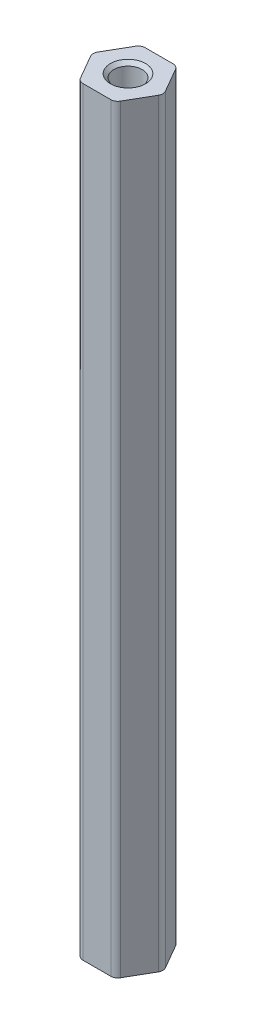
ISO-10303-21;
HEADER;
FILE_DESCRIPTION(('STEP AP214'),'2;1');
FILE_NAME('part.step','',(''),(''),'','','');
FILE_SCHEMA(('AUTOMOTIVE_DESIGN { 1 0 10303 214 1 1 1 1 }'));
ENDSEC;
DATA;
#1=APPLICATION_CONTEXT('core data for automotive mechanical design processes');
#2=APPLICATION_PROTOCOL_DEFINITION('international standard','automotive_design',2000,#1);
#3=PRODUCT_CONTEXT('',#1,'mechanical');
#4=PRODUCT('Part','Part','',(#3));
#5=PRODUCT_RELATED_PRODUCT_CATEGORY('part','',(#4));
#6=PRODUCT_DEFINITION_FORMATION('','',#4);
#7=PRODUCT_DEFINITION_CONTEXT('part definition',#1,'design');
#8=PRODUCT_DEFINITION('design','',#6,#7);
#9=PRODUCT_DEFINITION_SHAPE('','',#8);
#10=(LENGTH_UNIT() NAMED_UNIT(*) SI_UNIT(.MILLI.,.METRE.));
#11=(NAMED_UNIT(*) PLANE_ANGLE_UNIT() SI_UNIT($,.RADIAN.));
#12=(NAMED_UNIT(*) SI_UNIT($,.STERADIAN.) SOLID_ANGLE_UNIT());
#13=UNCERTAINTY_MEASURE_WITH_UNIT(LENGTH_MEASURE(1.E-05),#10,'distance_accuracy_value','');
#14=(GEOMETRIC_REPRESENTATION_CONTEXT(3) GLOBAL_UNCERTAINTY_ASSIGNED_CONTEXT((#13)) GLOBAL_UNIT_ASSIGNED_CONTEXT((#10,
#11,#12)) REPRESENTATION_CONTEXT('',''));
#15=CARTESIAN_POINT('',(0.,0.,0.));
#16=DIRECTION('',(0.,0.,1.));
#17=DIRECTION('',(1.,0.,0.));
#18=AXIS2_PLACEMENT_3D('',#15,#16,#17);
#19=CARTESIAN_POINT('',(-2.6035,55.0672,0.));
#20=DIRECTION('',(-0.866025403784438,0.,-0.500000000000001));
#21=DIRECTION('',(-0.500000000000001,0.,0.866025403784438));
#22=AXIS2_PLACEMENT_3D('',#19,#20,#21);
#23=PLANE('',#22);
#24=DIRECTION('',(0.500000000000001,0.,-0.866025403784438));
#25=VECTOR('',#24,1.);
#26=CARTESIAN_POINT('',(-2.6035,0.,0.));
#27=LINE('',#26,#25);
#28=CARTESIAN_POINT('',(-2.45685303162583,0.,-0.254000000000001));
#29=VERTEX_POINT('',#28);
#30=CARTESIAN_POINT('',(-1.44839696837416,0.,-2.00069713875279));
#31=VERTEX_POINT('',#30);
#32=EDGE_CURVE('E215',#29,#31,#27,.T.);
#33=ORIENTED_EDGE('',*,*,#32,.F.);
#34=DIRECTION('',(0.,-1.,0.));
#35=VECTOR('',#34,1.);
#36=CARTESIAN_POINT('',(-2.45685303162583,55.0672,-0.254000000000001));
#37=LINE('',#36,#35);
#38=CARTESIAN_POINT('',(-2.45685303162583,55.0672,-0.254000000000001));
#39=VERTEX_POINT('',#38);
#40=EDGE_CURVE('E170',#29,#39,#37,.F.);
#41=ORIENTED_EDGE('',*,*,#40,.T.);
#42=DIRECTION('',(0.500000000000001,0.,-0.866025403784438));
#43=VECTOR('',#42,1.);
#44=CARTESIAN_POINT('',(-2.6035,55.0672,0.));
#45=LINE('',#44,#43);
#46=CARTESIAN_POINT('',(-1.44839696837416,55.0672,-2.00069713875279));
#47=VERTEX_POINT('',#46);
#48=EDGE_CURVE('E147',#39,#47,#45,.T.);
#49=ORIENTED_EDGE('',*,*,#48,.T.);
#50=DIRECTION('',(0.,-1.,0.));
#51=VECTOR('',#50,1.);
#52=CARTESIAN_POINT('',(-1.44839696837416,55.0672,-2.00069713875279));
#53=LINE('',#52,#51);
#54=EDGE_CURVE('E167',#47,#31,#53,.T.);
#55=ORIENTED_EDGE('',*,*,#54,.T.);
#56=EDGE_LOOP('',(#33,#41,#49,#55));
#57=FACE_BOUND('',#56,.T.);
#58=ADVANCED_FACE('F36',(#57),#23,.T.);
#59=CARTESIAN_POINT('',(-1.30174999999999,55.0672,2.25469713875279));
#60=DIRECTION('',(-0.866025403784438,0.,0.500000000000001));
#61=DIRECTION('',(0.500000000000001,0.,0.866025403784438));
#62=AXIS2_PLACEMENT_3D('',#59,#60,#61);
#63=PLANE('',#62);
#64=DIRECTION('',(-0.500000000000001,0.,-0.866025403784438));
#65=VECTOR('',#64,1.);
#66=CARTESIAN_POINT('',(-1.30174999999999,55.0672,2.25469713875279));
#67=LINE('',#66,#65);
#68=CARTESIAN_POINT('',(-1.44839696837416,55.0672,2.00069713875279));
#69=VERTEX_POINT('',#68);
#70=CARTESIAN_POINT('',(-2.45685303162583,55.0672,0.254000000000001));
#71=VERTEX_POINT('',#70);
#72=EDGE_CURVE('E152',#69,#71,#67,.T.);
#73=ORIENTED_EDGE('',*,*,#72,.T.);
#74=DIRECTION('',(0.,-1.,0.));
#75=VECTOR('',#74,1.);
#76=CARTESIAN_POINT('',(-2.45685303162583,55.0672,0.254000000000001));
#77=LINE('',#76,#75);
#78=CARTESIAN_POINT('',(-2.45685303162583,0.,0.254000000000001));
#79=VERTEX_POINT('',#78);
#80=EDGE_CURVE('E146',#71,#79,#77,.T.);
#81=ORIENTED_EDGE('',*,*,#80,.T.);
#82=DIRECTION('',(-0.500000000000001,0.,-0.866025403784438));
#83=VECTOR('',#82,1.);
#84=CARTESIAN_POINT('',(-1.30174999999999,0.,2.25469713875279));
#85=LINE('',#84,#83);
#86=CARTESIAN_POINT('',(-1.44839696837416,0.,2.00069713875279));
#87=VERTEX_POINT('',#86);
#88=EDGE_CURVE('E129',#87,#79,#85,.T.);
#89=ORIENTED_EDGE('',*,*,#88,.F.);
#90=DIRECTION('',(0.,-1.,0.));
#91=VECTOR('',#90,1.);
#92=CARTESIAN_POINT('',(-1.44839696837416,55.0672,2.00069713875279));
#93=LINE('',#92,#91);
#94=EDGE_CURVE('E143',#87,#69,#93,.F.);
#95=ORIENTED_EDGE('',*,*,#94,.T.);
#96=EDGE_LOOP('',(#73,#81,#89,#95));
#97=FACE_BOUND('',#96,.T.);
#98=ADVANCED_FACE('F142',(#97),#63,.T.);
#99=CARTESIAN_POINT('',(1.30175,55.0672,2.25469713875279));
#100=DIRECTION('',(0.,0.,1.));
#101=DIRECTION('',(1.,0.,0.));
#102=AXIS2_PLACEMENT_3D('',#99,#100,#101);
#103=PLANE('',#102);
#104=DIRECTION('',(-1.,0.,0.));
#105=VECTOR('',#104,1.);
#106=CARTESIAN_POINT('',(1.30175,55.0672,2.25469713875279));
#107=LINE('',#106,#105);
#108=CARTESIAN_POINT('',(1.00845606325167,55.0672,2.25469713875279));
#109=VERTEX_POINT('',#108);
#110=CARTESIAN_POINT('',(-1.00845606325166,55.0672,2.25469713875279));
#111=VERTEX_POINT('',#110);
#112=EDGE_CURVE('E156',#109,#111,#107,.T.);
#113=ORIENTED_EDGE('',*,*,#112,.T.);
#114=DIRECTION('',(0.,-1.,0.));
#115=VECTOR('',#114,1.);
#116=CARTESIAN_POINT('',(-1.00845606325166,55.0672,2.25469713875279));
#117=LINE('',#116,#115);
#118=CARTESIAN_POINT('',(-1.00845606325166,0.,2.25469713875279));
#119=VERTEX_POINT('',#118);
#120=EDGE_CURVE('E184',#111,#119,#117,.T.);
#121=ORIENTED_EDGE('',*,*,#120,.T.);
#122=DIRECTION('',(-1.,0.,0.));
#123=VECTOR('',#122,1.);
#124=CARTESIAN_POINT('',(1.30175,0.,2.25469713875279));
#125=LINE('',#124,#123);
#126=CARTESIAN_POINT('',(1.00845606325167,0.,2.25469713875279));
#127=VERTEX_POINT('',#126);
#128=EDGE_CURVE('E131',#127,#119,#125,.T.);
#129=ORIENTED_EDGE('',*,*,#128,.F.);
#130=DIRECTION('',(0.,-1.,0.));
#131=VECTOR('',#130,1.);
#132=CARTESIAN_POINT('',(1.00845606325167,55.0672,2.25469713875279));
#133=LINE('',#132,#131);
#134=EDGE_CURVE('E182',#127,#109,#133,.F.);
#135=ORIENTED_EDGE('',*,*,#134,.T.);
#136=EDGE_LOOP('',(#113,#121,#129,#135));
#137=FACE_BOUND('',#136,.T.);
#138=ADVANCED_FACE('F269',(#137),#103,.T.);
#139=CARTESIAN_POINT('',(2.6035,55.0672,0.));
#140=DIRECTION('',(0.866025403784438,0.,0.500000000000001));
#141=DIRECTION('',(0.500000000000001,0.,-0.866025403784438));
#142=AXIS2_PLACEMENT_3D('',#139,#140,#141);
#143=PLANE('',#142);
#144=DIRECTION('',(-0.500000000000001,0.,0.866025403784438));
#145=VECTOR('',#144,1.);
#146=CARTESIAN_POINT('',(2.6035,0.,0.));
#147=LINE('',#146,#145);
#148=CARTESIAN_POINT('',(2.45685303162583,0.,0.254));
#149=VERTEX_POINT('',#148);
#150=CARTESIAN_POINT('',(1.44839696837416,0.,2.00069713875279));
#151=VERTEX_POINT('',#150);
#152=EDGE_CURVE('E201',#149,#151,#147,.T.);
#153=ORIENTED_EDGE('',*,*,#152,.F.);
#154=DIRECTION('',(0.,-1.,0.));
#155=VECTOR('',#154,1.);
#156=CARTESIAN_POINT('',(2.45685303162583,55.0672,0.254));
#157=LINE('',#156,#155);
#158=CARTESIAN_POINT('',(2.45685303162583,55.0672,0.254));
#159=VERTEX_POINT('',#158);
#160=EDGE_CURVE('E11',#149,#159,#157,.F.);
#161=ORIENTED_EDGE('',*,*,#160,.T.);
#162=DIRECTION('',(-0.500000000000001,0.,0.866025403784438));
#163=VECTOR('',#162,1.);
#164=CARTESIAN_POINT('',(2.6035,55.0672,0.));
#165=LINE('',#164,#163);
#166=CARTESIAN_POINT('',(1.44839696837416,55.0672,2.00069713875279));
#167=VERTEX_POINT('',#166);
#168=EDGE_CURVE('E204',#159,#167,#165,.T.);
#169=ORIENTED_EDGE('',*,*,#168,.T.);
#170=DIRECTION('',(0.,-1.,0.));
#171=VECTOR('',#170,1.);
#172=CARTESIAN_POINT('',(1.44839696837416,55.0672,2.00069713875279));
#173=LINE('',#172,#171);
#174=EDGE_CURVE('E44',#167,#151,#173,.T.);
#175=ORIENTED_EDGE('',*,*,#174,.T.);
#176=EDGE_LOOP('',(#153,#161,#169,#175));
#177=FACE_BOUND('',#176,.T.);
#178=ADVANCED_FACE('F200',(#177),#143,.T.);
#179=CARTESIAN_POINT('',(1.30174999999999,55.0672,-2.25469713875279));
#180=DIRECTION('',(0.866025403784438,0.,-0.500000000000001));
#181=DIRECTION('',(-0.500000000000001,0.,-0.866025403784438));
#182=AXIS2_PLACEMENT_3D('',#179,#180,#181);
#183=PLANE('',#182);
#184=DIRECTION('',(0.500000000000001,0.,0.866025403784438));
#185=VECTOR('',#184,1.);
#186=CARTESIAN_POINT('',(1.30174999999999,0.,-2.25469713875279));
#187=LINE('',#186,#185);
#188=CARTESIAN_POINT('',(1.44839696837416,0.,-2.00069713875279));
#189=VERTEX_POINT('',#188);
#190=CARTESIAN_POINT('',(2.45685303162583,0.,-0.254));
#191=VERTEX_POINT('',#190);
#192=EDGE_CURVE('E208',#189,#191,#187,.T.);
#193=ORIENTED_EDGE('',*,*,#192,.F.);
#194=DIRECTION('',(0.,-1.,0.));
#195=VECTOR('',#194,1.);
#196=CARTESIAN_POINT('',(1.44839696837416,55.0672,-2.00069713875279));
#197=LINE('',#196,#195);
#198=CARTESIAN_POINT('',(1.44839696837416,55.0672,-2.00069713875279));
#199=VERTEX_POINT('',#198);
#200=EDGE_CURVE('E193',#189,#199,#197,.F.);
#201=ORIENTED_EDGE('',*,*,#200,.T.);
#202=DIRECTION('',(0.500000000000001,0.,0.866025403784438));
#203=VECTOR('',#202,1.);
#204=CARTESIAN_POINT('',(1.30174999999999,55.0672,-2.25469713875279));
#205=LINE('',#204,#203);
#206=CARTESIAN_POINT('',(2.45685303162583,55.0672,-0.254));
#207=VERTEX_POINT('',#206);
#208=EDGE_CURVE('E222',#199,#207,#205,.T.);
#209=ORIENTED_EDGE('',*,*,#208,.T.);
#210=DIRECTION('',(0.,-1.,0.));
#211=VECTOR('',#210,1.);
#212=CARTESIAN_POINT('',(2.45685303162583,55.0672,-0.254000000000001));
#213=LINE('',#212,#211);
#214=EDGE_CURVE('E190',#207,#191,#213,.T.);
#215=ORIENTED_EDGE('',*,*,#214,.T.);
#216=EDGE_LOOP('',(#193,#201,#209,#215));
#217=FACE_BOUND('',#216,.T.);
#218=ADVANCED_FACE('F261',(#217),#183,.T.);
#219=CARTESIAN_POINT('',(-1.30175,55.0672,-2.25469713875279));
#220=DIRECTION('',(0.,0.,-1.));
#221=DIRECTION('',(-1.,0.,0.));
#222=AXIS2_PLACEMENT_3D('',#219,#220,#221);
#223=PLANE('',#222);
#224=DIRECTION('',(1.,0.,0.));
#225=VECTOR('',#224,1.);
#226=CARTESIAN_POINT('',(-1.30175,0.,-2.25469713875279));
#227=LINE('',#226,#225);
#228=CARTESIAN_POINT('',(-1.00845606325167,0.,-2.25469713875279));
#229=VERTEX_POINT('',#228);
#230=CARTESIAN_POINT('',(1.00845606325166,0.,-2.25469713875279));
#231=VERTEX_POINT('',#230);
#232=EDGE_CURVE('E210',#229,#231,#227,.T.);
#233=ORIENTED_EDGE('',*,*,#232,.F.);
#234=DIRECTION('',(0.,-1.,0.));
#235=VECTOR('',#234,1.);
#236=CARTESIAN_POINT('',(-1.00845606325167,55.0672,-2.25469713875279));
#237=LINE('',#236,#235);
#238=CARTESIAN_POINT('',(-1.00845606325167,55.0672,-2.25469713875279));
#239=VERTEX_POINT('',#238);
#240=EDGE_CURVE('E58',#229,#239,#237,.F.);
#241=ORIENTED_EDGE('',*,*,#240,.T.);
#242=DIRECTION('',(1.,0.,0.));
#243=VECTOR('',#242,1.);
#244=CARTESIAN_POINT('',(-1.30175,55.0672,-2.25469713875279));
#245=LINE('',#244,#243);
#246=CARTESIAN_POINT('',(1.00845606325166,55.0672,-2.25469713875279));
#247=VERTEX_POINT('',#246);
#248=EDGE_CURVE('E225',#239,#247,#245,.T.);
#249=ORIENTED_EDGE('',*,*,#248,.T.);
#250=DIRECTION('',(0.,-1.,0.));
#251=VECTOR('',#250,1.);
#252=CARTESIAN_POINT('',(1.00845606325166,55.0672,-2.25469713875279));
#253=LINE('',#252,#251);
#254=EDGE_CURVE('E186',#247,#231,#253,.T.);
#255=ORIENTED_EDGE('',*,*,#254,.T.);
#256=EDGE_LOOP('',(#233,#241,#249,#255));
#257=FACE_BOUND('',#256,.T.);
#258=ADVANCED_FACE('F242',(#257),#223,.T.);
#259=CARTESIAN_POINT('',(0.,55.0672,0.));
#260=DIRECTION('',(0.,-1.,0.));
#261=DIRECTION('',(0.,0.,-1.));
#262=AXIS2_PLACEMENT_3D('',#259,#260,#261);
#263=PLANE('',#262);
#264=CARTESIAN_POINT('',(0.,55.0672,0.));
#265=DIRECTION('',(0.,1.,0.));
#266=DIRECTION('',(0.,0.,1.));
#267=AXIS2_PLACEMENT_3D('',#264,#265,#266);
#268=CIRCLE('',#267,1.275);
#269=CARTESIAN_POINT('',(0.,55.0672,1.275));
#270=VERTEX_POINT('',#269);
#271=EDGE_CURVE('E234',#270,#270,#268,.T.);
#272=ORIENTED_EDGE('',*,*,#271,.F.);
#273=EDGE_LOOP('',(#272));
#274=FACE_BOUND('',#273,.T.);
#275=ORIENTED_EDGE('',*,*,#48,.F.);
#276=CARTESIAN_POINT('',(-2.01691212650334,55.0672,0.));
#277=DIRECTION('',(0.,-1.,0.));
#278=DIRECTION('',(0.,0.,-1.));
#279=AXIS2_PLACEMENT_3D('',#276,#277,#278);
#280=CIRCLE('',#279,0.508);
#281=EDGE_CURVE('E180',#39,#71,#280,.F.);
#282=ORIENTED_EDGE('',*,*,#281,.T.);
#283=ORIENTED_EDGE('',*,*,#72,.F.);
#284=CARTESIAN_POINT('',(-1.00845606325166,55.0672,1.74669713875279));
#285=DIRECTION('',(0.,-1.,0.));
#286=DIRECTION('',(0.,0.,-1.));
#287=AXIS2_PLACEMENT_3D('',#284,#285,#286);
#288=CIRCLE('',#287,0.508);
#289=EDGE_CURVE('E151',#69,#111,#288,.F.);
#290=ORIENTED_EDGE('',*,*,#289,.T.);
#291=ORIENTED_EDGE('',*,*,#112,.F.);
#292=CARTESIAN_POINT('',(1.00845606325167,55.0672,1.74669713875279));
#293=DIRECTION('',(0.,-1.,0.));
#294=DIRECTION('',(0.,0.,-1.));
#295=AXIS2_PLACEMENT_3D('',#292,#293,#294);
#296=CIRCLE('',#295,0.508);
#297=EDGE_CURVE('E172',#109,#167,#296,.F.);
#298=ORIENTED_EDGE('',*,*,#297,.T.);
#299=ORIENTED_EDGE('',*,*,#168,.F.);
#300=CARTESIAN_POINT('',(2.01691212650334,55.0672,0.));
#301=DIRECTION('',(0.,-1.,0.));
#302=DIRECTION('',(0.,0.,-1.));
#303=AXIS2_PLACEMENT_3D('',#300,#301,#302);
#304=CIRCLE('',#303,0.508);
#305=EDGE_CURVE('E174',#159,#207,#304,.F.);
#306=ORIENTED_EDGE('',*,*,#305,.T.);
#307=ORIENTED_EDGE('',*,*,#208,.F.);
#308=CARTESIAN_POINT('',(1.00845606325166,55.0672,-1.74669713875279));
#309=DIRECTION('',(0.,-1.,0.));
#310=DIRECTION('',(0.,0.,-1.));
#311=AXIS2_PLACEMENT_3D('',#308,#309,#310);
#312=CIRCLE('',#311,0.508);
#313=EDGE_CURVE('E51',#199,#247,#312,.F.);
#314=ORIENTED_EDGE('',*,*,#313,.T.);
#315=ORIENTED_EDGE('',*,*,#248,.F.);
#316=CARTESIAN_POINT('',(-1.00845606325167,55.0672,-1.74669713875279));
#317=DIRECTION('',(0.,-1.,0.));
#318=DIRECTION('',(0.,0.,-1.));
#319=AXIS2_PLACEMENT_3D('',#316,#317,#318);
#320=CIRCLE('',#319,0.508);
#321=EDGE_CURVE('E177',#239,#47,#320,.F.);
#322=ORIENTED_EDGE('',*,*,#321,.T.);
#323=EDGE_LOOP('',(#275,#282,#283,#290,#291,#298,#299,#306,#307,#314,#315,#322));
#324=FACE_BOUND('',#323,.T.);
#325=ADVANCED_FACE('F240',(#274,#324),#263,.F.);
#326=CARTESIAN_POINT('',(0.,0.,0.));
#327=DIRECTION('',(0.,-1.,0.));
#328=DIRECTION('',(0.,0.,-1.));
#329=AXIS2_PLACEMENT_3D('',#326,#327,#328);
#330=PLANE('',#329);
#331=CARTESIAN_POINT('',(0.,0.,0.));
#332=DIRECTION('',(0.,1.,0.));
#333=DIRECTION('',(0.,0.,1.));
#334=AXIS2_PLACEMENT_3D('',#331,#332,#333);
#335=CIRCLE('',#334,1.02499999999999);
#336=CARTESIAN_POINT('',(0.,0.,1.02499999999999));
#337=VERTEX_POINT('',#336);
#338=EDGE_CURVE('E217',#337,#337,#335,.T.);
#339=ORIENTED_EDGE('',*,*,#338,.T.);
#340=EDGE_LOOP('',(#339));
#341=FACE_BOUND('',#340,.T.);
#342=ORIENTED_EDGE('',*,*,#88,.T.);
#343=CARTESIAN_POINT('',(-2.01691212650334,0.,0.));
#344=DIRECTION('',(0.,-1.,0.));
#345=DIRECTION('',(0.,0.,-1.));
#346=AXIS2_PLACEMENT_3D('',#343,#344,#345);
#347=CIRCLE('',#346,0.508);
#348=EDGE_CURVE('E136',#79,#29,#347,.T.);
#349=ORIENTED_EDGE('',*,*,#348,.T.);
#350=ORIENTED_EDGE('',*,*,#32,.T.);
#351=CARTESIAN_POINT('',(-1.00845606325167,0.,-1.74669713875279));
#352=DIRECTION('',(0.,-1.,0.));
#353=DIRECTION('',(0.,0.,-1.));
#354=AXIS2_PLACEMENT_3D('',#351,#352,#353);
#355=CIRCLE('',#354,0.508);
#356=EDGE_CURVE('E137',#31,#229,#355,.T.);
#357=ORIENTED_EDGE('',*,*,#356,.T.);
#358=ORIENTED_EDGE('',*,*,#232,.T.);
#359=CARTESIAN_POINT('',(1.00845606325166,0.,-1.74669713875279));
#360=DIRECTION('',(0.,-1.,0.));
#361=DIRECTION('',(0.,0.,-1.));
#362=AXIS2_PLACEMENT_3D('',#359,#360,#361);
#363=CIRCLE('',#362,0.508);
#364=EDGE_CURVE('E163',#231,#189,#363,.T.);
#365=ORIENTED_EDGE('',*,*,#364,.T.);
#366=ORIENTED_EDGE('',*,*,#192,.T.);
#367=CARTESIAN_POINT('',(2.01691212650334,0.,0.));
#368=DIRECTION('',(0.,-1.,0.));
#369=DIRECTION('',(0.,0.,-1.));
#370=AXIS2_PLACEMENT_3D('',#367,#368,#369);
#371=CIRCLE('',#370,0.508);
#372=EDGE_CURVE('E161',#191,#149,#371,.T.);
#373=ORIENTED_EDGE('',*,*,#372,.T.);
#374=ORIENTED_EDGE('',*,*,#152,.T.);
#375=CARTESIAN_POINT('',(1.00845606325167,0.,1.74669713875279));
#376=DIRECTION('',(0.,-1.,0.));
#377=DIRECTION('',(0.,0.,-1.));
#378=AXIS2_PLACEMENT_3D('',#375,#376,#377);
#379=CIRCLE('',#378,0.508);
#380=EDGE_CURVE('E154',#151,#127,#379,.T.);
#381=ORIENTED_EDGE('',*,*,#380,.T.);
#382=ORIENTED_EDGE('',*,*,#128,.T.);
#383=CARTESIAN_POINT('',(-1.00845606325166,0.,1.74669713875279));
#384=DIRECTION('',(0.,-1.,0.));
#385=DIRECTION('',(0.,0.,-1.));
#386=AXIS2_PLACEMENT_3D('',#383,#384,#385);
#387=CIRCLE('',#386,0.508);
#388=EDGE_CURVE('E126',#119,#87,#387,.T.);
#389=ORIENTED_EDGE('',*,*,#388,.T.);
#390=EDGE_LOOP('',(#342,#349,#350,#357,#358,#365,#366,#373,#374,#381,#382,#389));
#391=FACE_BOUND('',#390,.T.);
#392=ADVANCED_FACE('F128',(#341,#391),#330,.T.);
#393=CARTESIAN_POINT('',(-2.01691212650334,55.0672,0.));
#394=DIRECTION('',(0.,-1.,0.));
#395=DIRECTION('',(0.,0.,-1.));
#396=AXIS2_PLACEMENT_3D('',#393,#394,#395);
#397=CYLINDRICAL_SURFACE('',#396,0.508);
#398=ORIENTED_EDGE('',*,*,#281,.F.);
#399=ORIENTED_EDGE('',*,*,#40,.F.);
#400=ORIENTED_EDGE('',*,*,#348,.F.);
#401=ORIENTED_EDGE('',*,*,#80,.F.);
#402=EDGE_LOOP('',(#398,#399,#400,#401));
#403=FACE_BOUND('',#402,.T.);
#404=ADVANCED_FACE('F251',(#403),#397,.T.);
#405=CARTESIAN_POINT('',(-1.00845606325166,55.0672,1.74669713875279));
#406=DIRECTION('',(0.,-1.,0.));
#407=DIRECTION('',(0.,0.,-1.));
#408=AXIS2_PLACEMENT_3D('',#405,#406,#407);
#409=CYLINDRICAL_SURFACE('',#408,0.508);
#410=ORIENTED_EDGE('',*,*,#289,.F.);
#411=ORIENTED_EDGE('',*,*,#94,.F.);
#412=ORIENTED_EDGE('',*,*,#388,.F.);
#413=ORIENTED_EDGE('',*,*,#120,.F.);
#414=EDGE_LOOP('',(#410,#411,#412,#413));
#415=FACE_BOUND('',#414,.T.);
#416=ADVANCED_FACE('F150',(#415),#409,.T.);
#417=CARTESIAN_POINT('',(-1.00845606325167,55.0672,-1.74669713875279));
#418=DIRECTION('',(0.,-1.,0.));
#419=DIRECTION('',(0.,0.,-1.));
#420=AXIS2_PLACEMENT_3D('',#417,#418,#419);
#421=CYLINDRICAL_SURFACE('',#420,0.508);
#422=ORIENTED_EDGE('',*,*,#321,.F.);
#423=ORIENTED_EDGE('',*,*,#240,.F.);
#424=ORIENTED_EDGE('',*,*,#356,.F.);
#425=ORIENTED_EDGE('',*,*,#54,.F.);
#426=EDGE_LOOP('',(#422,#423,#424,#425));
#427=FACE_BOUND('',#426,.T.);
#428=ADVANCED_FACE('F254',(#427),#421,.T.);
#429=CARTESIAN_POINT('',(1.00845606325166,55.0672,-1.74669713875279));
#430=DIRECTION('',(0.,-1.,0.));
#431=DIRECTION('',(0.,0.,-1.));
#432=AXIS2_PLACEMENT_3D('',#429,#430,#431);
#433=CYLINDRICAL_SURFACE('',#432,0.508);
#434=ORIENTED_EDGE('',*,*,#313,.F.);
#435=ORIENTED_EDGE('',*,*,#200,.F.);
#436=ORIENTED_EDGE('',*,*,#364,.F.);
#437=ORIENTED_EDGE('',*,*,#254,.F.);
#438=EDGE_LOOP('',(#434,#435,#436,#437));
#439=FACE_BOUND('',#438,.T.);
#440=ADVANCED_FACE('F257',(#439),#433,.T.);
#441=CARTESIAN_POINT('',(2.01691212650334,55.0672,0.));
#442=DIRECTION('',(0.,-1.,0.));
#443=DIRECTION('',(0.,0.,-1.));
#444=AXIS2_PLACEMENT_3D('',#441,#442,#443);
#445=CYLINDRICAL_SURFACE('',#444,0.508);
#446=ORIENTED_EDGE('',*,*,#305,.F.);
#447=ORIENTED_EDGE('',*,*,#160,.F.);
#448=ORIENTED_EDGE('',*,*,#372,.F.);
#449=ORIENTED_EDGE('',*,*,#214,.F.);
#450=EDGE_LOOP('',(#446,#447,#448,#449));
#451=FACE_BOUND('',#450,.T.);
#452=ADVANCED_FACE('F265',(#451),#445,.T.);
#453=CARTESIAN_POINT('',(1.00845606325167,55.0672,1.74669713875279));
#454=DIRECTION('',(0.,-1.,0.));
#455=DIRECTION('',(0.,0.,-1.));
#456=AXIS2_PLACEMENT_3D('',#453,#454,#455);
#457=CYLINDRICAL_SURFACE('',#456,0.508);
#458=ORIENTED_EDGE('',*,*,#297,.F.);
#459=ORIENTED_EDGE('',*,*,#134,.F.);
#460=ORIENTED_EDGE('',*,*,#380,.F.);
#461=ORIENTED_EDGE('',*,*,#174,.F.);
#462=EDGE_LOOP('',(#458,#459,#460,#461));
#463=FACE_BOUND('',#462,.T.);
#464=ADVANCED_FACE('F38',(#463),#457,.T.);
#465=CARTESIAN_POINT('',(0.,55.0672,0.));
#466=DIRECTION('',(0.,1.,0.));
#467=DIRECTION('',(0.,0.,1.));
#468=AXIS2_PLACEMENT_3D('',#465,#466,#467);
#469=CYLINDRICAL_SURFACE('',#468,1.02499999999999);
#470=ORIENTED_EDGE('',*,*,#338,.F.);
#471=EDGE_LOOP('',(#470));
#472=FACE_BOUND('',#471,.T.);
#473=CARTESIAN_POINT('',(0.,54.8172,0.));
#474=DIRECTION('',(0.,1.,0.));
#475=DIRECTION('',(0.,0.,1.));
#476=AXIS2_PLACEMENT_3D('',#473,#474,#475);
#477=CIRCLE('',#476,1.02499999999999);
#478=CARTESIAN_POINT('',(0.,54.8172,1.02499999999999));
#479=VERTEX_POINT('',#478);
#480=EDGE_CURVE('E231',#479,#479,#477,.T.);
#481=ORIENTED_EDGE('',*,*,#480,.T.);
#482=EDGE_LOOP('',(#481));
#483=FACE_BOUND('',#482,.T.);
#484=ADVANCED_FACE('F296',(#472,#483),#469,.F.);
#485=CARTESIAN_POINT('',(0.,55.0672,0.));
#486=DIRECTION('',(0.,1.,0.));
#487=DIRECTION('',(0.,0.,1.));
#488=AXIS2_PLACEMENT_3D('',#485,#486,#487);
#489=CONICAL_SURFACE('',#488,1.275,0.785398163397461);
#490=ORIENTED_EDGE('',*,*,#480,.F.);
#491=EDGE_LOOP('',(#490));
#492=FACE_BOUND('',#491,.T.);
#493=ORIENTED_EDGE('',*,*,#271,.T.);
#494=EDGE_LOOP('',(#493));
#495=FACE_BOUND('',#494,.T.);
#496=ADVANCED_FACE('F238',(#492,#495),#489,.F.);
#497=CLOSED_SHELL('',(#58,#98,#138,#178,#218,#258,#325,#392,#404,#416,#428,#440,#452,#464,#484,#496));
#498=MANIFOLD_SOLID_BREP('B2',#497);
#499=ADVANCED_BREP_SHAPE_REPRESENTATION('',(#18,#498),#14);
#500=SHAPE_DEFINITION_REPRESENTATION(#9,#499);
ENDSEC;
END-ISO-10303-21;
